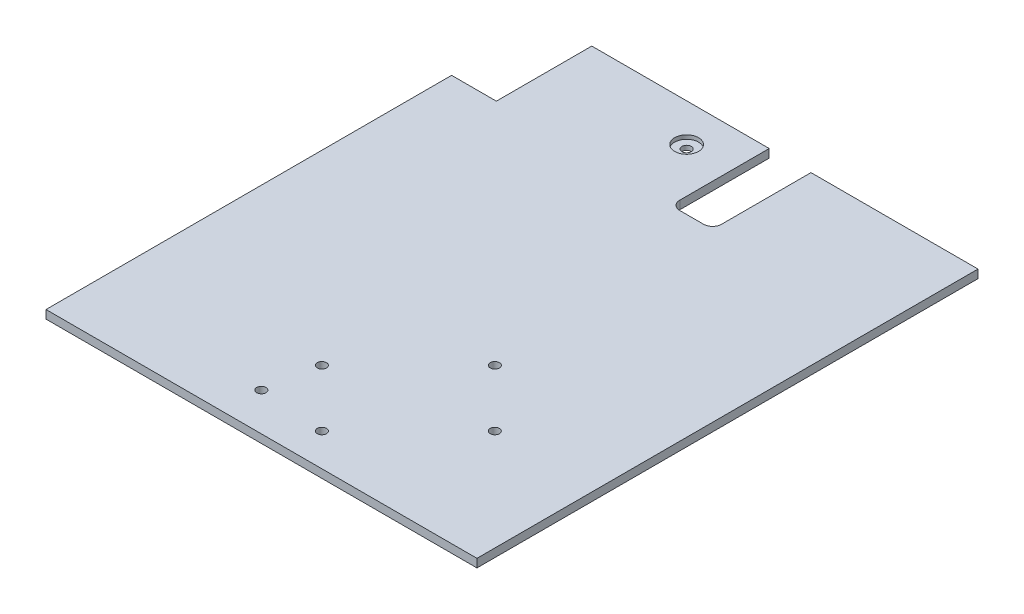
ISO-10303-21;
HEADER;
FILE_DESCRIPTION(('STEP AP214'),'2;1');
FILE_NAME('part.step','',(''),(''),'','','');
FILE_SCHEMA(('AUTOMOTIVE_DESIGN { 1 0 10303 214 1 1 1 1 }'));
ENDSEC;
DATA;
#1=APPLICATION_CONTEXT('core data for automotive mechanical design processes');
#2=APPLICATION_PROTOCOL_DEFINITION('international standard','automotive_design',2000,#1);
#3=PRODUCT_CONTEXT('',#1,'mechanical');
#4=PRODUCT('Part','Part','',(#3));
#5=PRODUCT_RELATED_PRODUCT_CATEGORY('part','',(#4));
#6=PRODUCT_DEFINITION_FORMATION('','',#4);
#7=PRODUCT_DEFINITION_CONTEXT('part definition',#1,'design');
#8=PRODUCT_DEFINITION('design','',#6,#7);
#9=PRODUCT_DEFINITION_SHAPE('','',#8);
#10=(LENGTH_UNIT() NAMED_UNIT(*) SI_UNIT(.MILLI.,.METRE.));
#11=(NAMED_UNIT(*) PLANE_ANGLE_UNIT() SI_UNIT($,.RADIAN.));
#12=(NAMED_UNIT(*) SI_UNIT($,.STERADIAN.) SOLID_ANGLE_UNIT());
#13=UNCERTAINTY_MEASURE_WITH_UNIT(LENGTH_MEASURE(1.E-05),#10,'distance_accuracy_value','');
#14=(GEOMETRIC_REPRESENTATION_CONTEXT(3) GLOBAL_UNCERTAINTY_ASSIGNED_CONTEXT((#13)) GLOBAL_UNIT_ASSIGNED_CONTEXT((#10,
#11,#12)) REPRESENTATION_CONTEXT('',''));
#15=CARTESIAN_POINT('',(0.,0.,0.));
#16=DIRECTION('',(0.,0.,1.));
#17=DIRECTION('',(1.,0.,0.));
#18=AXIS2_PLACEMENT_3D('',#15,#16,#17);
#19=CARTESIAN_POINT('',(0.,2.8,-84.));
#20=DIRECTION('',(0.,0.,-1.));
#21=DIRECTION('',(-1.,0.,0.));
#22=AXIS2_PLACEMENT_3D('',#19,#20,#21);
#23=PLANE('',#22);
#24=DIRECTION('',(0.,1.,0.));
#25=VECTOR('',#24,1.);
#26=CARTESIAN_POINT('',(16.25,-0.00100000000000013,-84.));
#27=LINE('',#26,#25);
#28=CARTESIAN_POINT('',(16.25,0.,-84.));
#29=VERTEX_POINT('',#28);
#30=CARTESIAN_POINT('',(16.25,2.8,-84.));
#31=VERTEX_POINT('',#30);
#32=EDGE_CURVE('E248',#29,#31,#27,.T.);
#33=ORIENTED_EDGE('',*,*,#32,.T.);
#34=DIRECTION('',(1.,0.,0.));
#35=VECTOR('',#34,1.);
#36=CARTESIAN_POINT('',(0.,2.8,-84.));
#37=LINE('',#36,#35);
#38=CARTESIAN_POINT('',(72.25,2.8,-84.));
#39=VERTEX_POINT('',#38);
#40=EDGE_CURVE('E60',#31,#39,#37,.T.);
#41=ORIENTED_EDGE('',*,*,#40,.T.);
#42=DIRECTION('',(0.,-1.,0.));
#43=VECTOR('',#42,1.);
#44=CARTESIAN_POINT('',(72.25,2.8,-84.));
#45=LINE('',#44,#43);
#46=CARTESIAN_POINT('',(72.25,0.,-84.));
#47=VERTEX_POINT('',#46);
#48=EDGE_CURVE('E139',#39,#47,#45,.T.);
#49=ORIENTED_EDGE('',*,*,#48,.T.);
#50=DIRECTION('',(1.,0.,0.));
#51=VECTOR('',#50,1.);
#52=CARTESIAN_POINT('',(0.,0.,-84.));
#53=LINE('',#52,#51);
#54=EDGE_CURVE('E87',#29,#47,#53,.T.);
#55=ORIENTED_EDGE('',*,*,#54,.F.);
#56=EDGE_LOOP('',(#33,#41,#49,#55));
#57=FACE_BOUND('',#56,.T.);
#58=ADVANCED_FACE('F35',(#57),#23,.T.);
#59=CARTESIAN_POINT('',(-12.75,-0.00100000000000013,-71.3));
#60=DIRECTION('',(0.,1.,0.));
#61=DIRECTION('',(0.,0.,1.));
#62=AXIS2_PLACEMENT_3D('',#59,#60,#61);
#63=CYLINDRICAL_SURFACE('',#62,1.54999999999999);
#64=CARTESIAN_POINT('',(-12.75,0.,-71.3));
#65=DIRECTION('',(0.,1.,0.));
#66=DIRECTION('',(0.,0.,1.));
#67=AXIS2_PLACEMENT_3D('',#64,#65,#66);
#68=CIRCLE('',#67,1.54999999999999);
#69=CARTESIAN_POINT('',(-12.75,0.,-69.75));
#70=VERTEX_POINT('',#69);
#71=EDGE_CURVE('E144',#70,#70,#68,.F.);
#72=ORIENTED_EDGE('',*,*,#71,.T.);
#73=EDGE_LOOP('',(#72));
#74=FACE_BOUND('',#73,.T.);
#75=CARTESIAN_POINT('',(-12.75,1.5,-71.3));
#76=DIRECTION('',(0.,1.,0.));
#77=DIRECTION('',(0.,0.,1.));
#78=AXIS2_PLACEMENT_3D('',#75,#76,#77);
#79=CIRCLE('',#78,1.54999999999999);
#80=CARTESIAN_POINT('',(-12.75,1.5,-69.75));
#81=VERTEX_POINT('',#80);
#82=EDGE_CURVE('E39',#81,#81,#79,.F.);
#83=ORIENTED_EDGE('',*,*,#82,.F.);
#84=EDGE_LOOP('',(#83));
#85=FACE_BOUND('',#84,.T.);
#86=ADVANCED_FACE('F318',(#74,#85),#63,.F.);
#87=DIRECTION('',(0.,1.,0.));
#88=VECTOR('',#87,1.);
#89=CARTESIAN_POINT('',(2.24999999999999,-0.00100000000000013,-84.));
#90=LINE('',#89,#88);
#91=CARTESIAN_POINT('',(2.24999999999999,0.,-84.));
#92=VERTEX_POINT('',#91);
#93=CARTESIAN_POINT('',(2.24999999999999,2.8,-84.));
#94=VERTEX_POINT('',#93);
#95=EDGE_CURVE('E208',#92,#94,#90,.T.);
#96=ORIENTED_EDGE('',*,*,#95,.F.);
#97=CARTESIAN_POINT('',(-57.25,0.,-84.));
#98=VERTEX_POINT('',#97);
#99=EDGE_CURVE('E153',#98,#92,#53,.T.);
#100=ORIENTED_EDGE('',*,*,#99,.F.);
#101=DIRECTION('',(0.,-1.,0.));
#102=VECTOR('',#101,1.);
#103=CARTESIAN_POINT('',(-57.25,2.8,-84.));
#104=LINE('',#103,#102);
#105=CARTESIAN_POINT('',(-57.25,2.8,-84.));
#106=VERTEX_POINT('',#105);
#107=EDGE_CURVE('E11',#106,#98,#104,.T.);
#108=ORIENTED_EDGE('',*,*,#107,.F.);
#109=EDGE_CURVE('E192',#106,#94,#37,.T.);
#110=ORIENTED_EDGE('',*,*,#109,.T.);
#111=EDGE_LOOP('',(#96,#100,#108,#110));
#112=FACE_BOUND('',#111,.T.);
#113=ADVANCED_FACE('F205',(#112),#23,.T.);
#114=CARTESIAN_POINT('',(-57.25,2.8,0.));
#115=DIRECTION('',(1.,0.,0.));
#116=DIRECTION('',(0.,0.,-1.));
#117=AXIS2_PLACEMENT_3D('',#114,#115,#116);
#118=PLANE('',#117);
#119=DIRECTION('',(0.,0.,1.));
#120=VECTOR('',#119,1.);
#121=CARTESIAN_POINT('',(-57.25,0.,0.));
#122=LINE('',#121,#120);
#123=CARTESIAN_POINT('',(-57.25,0.,-52.));
#124=VERTEX_POINT('',#123);
#125=EDGE_CURVE('E156',#98,#124,#122,.T.);
#126=ORIENTED_EDGE('',*,*,#125,.T.);
#127=DIRECTION('',(0.,-1.,0.));
#128=VECTOR('',#127,1.);
#129=CARTESIAN_POINT('',(-57.25,2.8,-52.));
#130=LINE('',#129,#128);
#131=CARTESIAN_POINT('',(-57.25,2.8,-52.));
#132=VERTEX_POINT('',#131);
#133=EDGE_CURVE('E44',#132,#124,#130,.T.);
#134=ORIENTED_EDGE('',*,*,#133,.F.);
#135=DIRECTION('',(0.,0.,1.));
#136=VECTOR('',#135,1.);
#137=CARTESIAN_POINT('',(-57.25,2.8,0.));
#138=LINE('',#137,#136);
#139=EDGE_CURVE('E134',#106,#132,#138,.T.);
#140=ORIENTED_EDGE('',*,*,#139,.F.);
#141=ORIENTED_EDGE('',*,*,#107,.T.);
#142=EDGE_LOOP('',(#126,#134,#140,#141));
#143=FACE_BOUND('',#142,.T.);
#144=ADVANCED_FACE('F178',(#143),#118,.F.);
#145=CARTESIAN_POINT('',(0.,2.8,-52.));
#146=DIRECTION('',(0.,0.,-1.));
#147=DIRECTION('',(-1.,0.,0.));
#148=AXIS2_PLACEMENT_3D('',#145,#146,#147);
#149=PLANE('',#148);
#150=DIRECTION('',(1.,0.,0.));
#151=VECTOR('',#150,1.);
#152=CARTESIAN_POINT('',(0.,0.,-52.));
#153=LINE('',#152,#151);
#154=CARTESIAN_POINT('',(-72.25,0.,-52.));
#155=VERTEX_POINT('',#154);
#156=EDGE_CURVE('E159',#155,#124,#153,.T.);
#157=ORIENTED_EDGE('',*,*,#156,.F.);
#158=DIRECTION('',(0.,-1.,0.));
#159=VECTOR('',#158,1.);
#160=CARTESIAN_POINT('',(-72.25,2.8,-52.));
#161=LINE('',#160,#159);
#162=CARTESIAN_POINT('',(-72.25,2.8,-52.));
#163=VERTEX_POINT('',#162);
#164=EDGE_CURVE('E116',#163,#155,#161,.T.);
#165=ORIENTED_EDGE('',*,*,#164,.F.);
#166=DIRECTION('',(1.,0.,0.));
#167=VECTOR('',#166,1.);
#168=CARTESIAN_POINT('',(0.,2.8,-52.));
#169=LINE('',#168,#167);
#170=EDGE_CURVE('E132',#163,#132,#169,.T.);
#171=ORIENTED_EDGE('',*,*,#170,.T.);
#172=ORIENTED_EDGE('',*,*,#133,.T.);
#173=EDGE_LOOP('',(#157,#165,#171,#172));
#174=FACE_BOUND('',#173,.T.);
#175=ADVANCED_FACE('F175',(#174),#149,.T.);
#176=CARTESIAN_POINT('',(-72.25,2.8,0.));
#177=DIRECTION('',(-1.,0.,0.));
#178=DIRECTION('',(0.,0.,1.));
#179=AXIS2_PLACEMENT_3D('',#176,#177,#178);
#180=PLANE('',#179);
#181=DIRECTION('',(0.,0.,-1.));
#182=VECTOR('',#181,1.);
#183=CARTESIAN_POINT('',(-72.25,0.,0.));
#184=LINE('',#183,#182);
#185=CARTESIAN_POINT('',(-72.25,0.,84.));
#186=VERTEX_POINT('',#185);
#187=EDGE_CURVE('E112',#186,#155,#184,.T.);
#188=ORIENTED_EDGE('',*,*,#187,.F.);
#189=DIRECTION('',(0.,-1.,0.));
#190=VECTOR('',#189,1.);
#191=CARTESIAN_POINT('',(-72.25,2.8,84.));
#192=LINE('',#191,#190);
#193=CARTESIAN_POINT('',(-72.25,2.8,84.));
#194=VERTEX_POINT('',#193);
#195=EDGE_CURVE('E106',#194,#186,#192,.T.);
#196=ORIENTED_EDGE('',*,*,#195,.F.);
#197=DIRECTION('',(0.,0.,-1.));
#198=VECTOR('',#197,1.);
#199=CARTESIAN_POINT('',(-72.25,2.8,0.));
#200=LINE('',#199,#198);
#201=EDGE_CURVE('E110',#194,#163,#200,.T.);
#202=ORIENTED_EDGE('',*,*,#201,.T.);
#203=ORIENTED_EDGE('',*,*,#164,.T.);
#204=EDGE_LOOP('',(#188,#196,#202,#203));
#205=FACE_BOUND('',#204,.T.);
#206=ADVANCED_FACE('F108',(#205),#180,.T.);
#207=CARTESIAN_POINT('',(0.,2.8,84.));
#208=DIRECTION('',(0.,0.,-1.));
#209=DIRECTION('',(-1.,0.,0.));
#210=AXIS2_PLACEMENT_3D('',#207,#208,#209);
#211=PLANE('',#210);
#212=DIRECTION('',(1.,0.,0.));
#213=VECTOR('',#212,1.);
#214=CARTESIAN_POINT('',(0.,0.,84.));
#215=LINE('',#214,#213);
#216=CARTESIAN_POINT('',(72.25,0.,84.));
#217=VERTEX_POINT('',#216);
#218=EDGE_CURVE('E163',#186,#217,#215,.T.);
#219=ORIENTED_EDGE('',*,*,#218,.T.);
#220=DIRECTION('',(0.,-1.,0.));
#221=VECTOR('',#220,1.);
#222=CARTESIAN_POINT('',(72.25,2.8,84.));
#223=LINE('',#222,#221);
#224=CARTESIAN_POINT('',(72.25,2.8,84.));
#225=VERTEX_POINT('',#224);
#226=EDGE_CURVE('E117',#225,#217,#223,.T.);
#227=ORIENTED_EDGE('',*,*,#226,.F.);
#228=DIRECTION('',(1.,0.,0.));
#229=VECTOR('',#228,1.);
#230=CARTESIAN_POINT('',(0.,2.8,84.));
#231=LINE('',#230,#229);
#232=EDGE_CURVE('E121',#194,#225,#231,.T.);
#233=ORIENTED_EDGE('',*,*,#232,.F.);
#234=ORIENTED_EDGE('',*,*,#195,.T.);
#235=EDGE_LOOP('',(#219,#227,#233,#234));
#236=FACE_BOUND('',#235,.T.);
#237=ADVANCED_FACE('F122',(#236),#211,.F.);
#238=CARTESIAN_POINT('',(19.1997474683059,2.8,24.9583694396574));
#239=DIRECTION('',(0.,-1.,0.));
#240=DIRECTION('',(0.,0.,-1.));
#241=AXIS2_PLACEMENT_3D('',#238,#239,#240);
#242=CYLINDRICAL_SURFACE('',#241,1.55);
#243=CARTESIAN_POINT('',(19.1997474683059,2.8,24.9583694396574));
#244=DIRECTION('',(0.,1.,0.));
#245=DIRECTION('',(0.,0.,1.));
#246=AXIS2_PLACEMENT_3D('',#243,#244,#245);
#247=CIRCLE('',#246,1.55);
#248=CARTESIAN_POINT('',(19.1997474683059,2.8,26.5083694396574));
#249=VERTEX_POINT('',#248);
#250=EDGE_CURVE('E193',#249,#249,#247,.T.);
#251=ORIENTED_EDGE('',*,*,#250,.T.);
#252=EDGE_LOOP('',(#251));
#253=FACE_BOUND('',#252,.T.);
#254=CARTESIAN_POINT('',(19.1997474683059,0.,24.9583694396574));
#255=DIRECTION('',(0.,1.,0.));
#256=DIRECTION('',(0.,0.,1.));
#257=AXIS2_PLACEMENT_3D('',#254,#255,#256);
#258=CIRCLE('',#257,1.55);
#259=CARTESIAN_POINT('',(19.1997474683059,0.,26.5083694396574));
#260=VERTEX_POINT('',#259);
#261=EDGE_CURVE('E150',#260,#260,#258,.T.);
#262=ORIENTED_EDGE('',*,*,#261,.F.);
#263=EDGE_LOOP('',(#262));
#264=FACE_BOUND('',#263,.T.);
#265=ADVANCED_FACE('F298',(#253,#264),#242,.F.);
#266=CARTESIAN_POINT('',(38.2916305603426,2.8,44.0502525316942));
#267=DIRECTION('',(0.,-1.,0.));
#268=DIRECTION('',(0.,0.,-1.));
#269=AXIS2_PLACEMENT_3D('',#266,#267,#268);
#270=CYLINDRICAL_SURFACE('',#269,1.55);
#271=CARTESIAN_POINT('',(38.2916305603426,2.8,44.0502525316942));
#272=DIRECTION('',(0.,1.,0.));
#273=DIRECTION('',(0.,0.,1.));
#274=AXIS2_PLACEMENT_3D('',#271,#272,#273);
#275=CIRCLE('',#274,1.55);
#276=CARTESIAN_POINT('',(38.2916305603426,2.8,45.6002525316942));
#277=VERTEX_POINT('',#276);
#278=EDGE_CURVE('E196',#277,#277,#275,.T.);
#279=ORIENTED_EDGE('',*,*,#278,.T.);
#280=EDGE_LOOP('',(#279));
#281=FACE_BOUND('',#280,.T.);
#282=CARTESIAN_POINT('',(38.2916305603426,0.,44.0502525316942));
#283=DIRECTION('',(0.,1.,0.));
#284=DIRECTION('',(0.,0.,1.));
#285=AXIS2_PLACEMENT_3D('',#282,#283,#284);
#286=CIRCLE('',#285,1.55);
#287=CARTESIAN_POINT('',(38.2916305603426,0.,45.6002525316942));
#288=VERTEX_POINT('',#287);
#289=EDGE_CURVE('E147',#288,#288,#286,.T.);
#290=ORIENTED_EDGE('',*,*,#289,.F.);
#291=EDGE_LOOP('',(#290));
#292=FACE_BOUND('',#291,.T.);
#293=ADVANCED_FACE('F290',(#281,#292),#270,.F.);
#294=CARTESIAN_POINT('',(-9.79163056034263,2.8,53.9497474683058));
#295=DIRECTION('',(0.,-1.,0.));
#296=DIRECTION('',(0.,0.,-1.));
#297=AXIS2_PLACEMENT_3D('',#294,#295,#296);
#298=CYLINDRICAL_SURFACE('',#297,1.55);
#299=CARTESIAN_POINT('',(-9.79163056034263,2.8,53.9497474683058));
#300=DIRECTION('',(0.,1.,0.));
#301=DIRECTION('',(0.,0.,1.));
#302=AXIS2_PLACEMENT_3D('',#299,#300,#301);
#303=CIRCLE('',#302,1.55);
#304=CARTESIAN_POINT('',(-9.79163056034263,2.8,55.4997474683058));
#305=VERTEX_POINT('',#304);
#306=EDGE_CURVE('E285',#305,#305,#303,.T.);
#307=ORIENTED_EDGE('',*,*,#306,.T.);
#308=EDGE_LOOP('',(#307));
#309=FACE_BOUND('',#308,.T.);
#310=CARTESIAN_POINT('',(-9.79163056034263,0.,53.9497474683058));
#311=DIRECTION('',(0.,1.,0.));
#312=DIRECTION('',(0.,0.,1.));
#313=AXIS2_PLACEMENT_3D('',#310,#311,#312);
#314=CIRCLE('',#313,1.55);
#315=CARTESIAN_POINT('',(-9.79163056034263,0.,55.4997474683058));
#316=VERTEX_POINT('',#315);
#317=EDGE_CURVE('E143',#316,#316,#314,.T.);
#318=ORIENTED_EDGE('',*,*,#317,.F.);
#319=EDGE_LOOP('',(#318));
#320=FACE_BOUND('',#319,.T.);
#321=ADVANCED_FACE('F342',(#309,#320),#298,.F.);
#322=CARTESIAN_POINT('',(9.30025253169412,2.8,73.0416305603426));
#323=DIRECTION('',(0.,-1.,0.));
#324=DIRECTION('',(0.,0.,-1.));
#325=AXIS2_PLACEMENT_3D('',#322,#323,#324);
#326=CYLINDRICAL_SURFACE('',#325,1.55);
#327=CARTESIAN_POINT('',(9.30025253169412,2.8,73.0416305603426));
#328=DIRECTION('',(0.,1.,0.));
#329=DIRECTION('',(0.,0.,1.));
#330=AXIS2_PLACEMENT_3D('',#327,#328,#329);
#331=CIRCLE('',#330,1.55);
#332=CARTESIAN_POINT('',(9.30025253169412,2.8,74.5916305603426));
#333=VERTEX_POINT('',#332);
#334=EDGE_CURVE('E168',#333,#333,#331,.T.);
#335=ORIENTED_EDGE('',*,*,#334,.T.);
#336=EDGE_LOOP('',(#335));
#337=FACE_BOUND('',#336,.T.);
#338=CARTESIAN_POINT('',(9.30025253169412,0.,73.0416305603426));
#339=DIRECTION('',(0.,1.,0.));
#340=DIRECTION('',(0.,0.,1.));
#341=AXIS2_PLACEMENT_3D('',#338,#339,#340);
#342=CIRCLE('',#341,1.55);
#343=CARTESIAN_POINT('',(9.30025253169412,0.,74.5916305603426));
#344=VERTEX_POINT('',#343);
#345=EDGE_CURVE('E140',#344,#344,#342,.T.);
#346=ORIENTED_EDGE('',*,*,#345,.F.);
#347=EDGE_LOOP('',(#346));
#348=FACE_BOUND('',#347,.T.);
#349=ADVANCED_FACE('F37',(#337,#348),#326,.F.);
#350=CARTESIAN_POINT('',(72.25,2.8,0.));
#351=DIRECTION('',(-1.,0.,0.));
#352=DIRECTION('',(0.,0.,1.));
#353=AXIS2_PLACEMENT_3D('',#350,#351,#352);
#354=PLANE('',#353);
#355=DIRECTION('',(0.,0.,-1.));
#356=VECTOR('',#355,1.);
#357=CARTESIAN_POINT('',(72.25,0.,0.));
#358=LINE('',#357,#356);
#359=EDGE_CURVE('E165',#217,#47,#358,.T.);
#360=ORIENTED_EDGE('',*,*,#359,.T.);
#361=ORIENTED_EDGE('',*,*,#48,.F.);
#362=DIRECTION('',(0.,0.,-1.));
#363=VECTOR('',#362,1.);
#364=CARTESIAN_POINT('',(72.25,2.8,0.));
#365=LINE('',#364,#363);
#366=EDGE_CURVE('E125',#225,#39,#365,.T.);
#367=ORIENTED_EDGE('',*,*,#366,.F.);
#368=ORIENTED_EDGE('',*,*,#226,.T.);
#369=EDGE_LOOP('',(#360,#361,#367,#368));
#370=FACE_BOUND('',#369,.T.);
#371=ADVANCED_FACE('F183',(#370),#354,.F.);
#372=CARTESIAN_POINT('',(0.,2.8,0.));
#373=DIRECTION('',(0.,1.,0.));
#374=DIRECTION('',(0.,0.,1.));
#375=AXIS2_PLACEMENT_3D('',#372,#373,#374);
#376=PLANE('',#375);
#377=DIRECTION('',(0.,0.,-1.));
#378=VECTOR('',#377,1.);
#379=CARTESIAN_POINT('',(16.25,2.8,-84.));
#380=LINE('',#379,#378);
#381=CARTESIAN_POINT('',(16.25,2.8,-54.));
#382=VERTEX_POINT('',#381);
#383=EDGE_CURVE('E188',#382,#31,#380,.T.);
#384=ORIENTED_EDGE('',*,*,#383,.F.);
#385=CARTESIAN_POINT('',(13.25,2.8,-54.));
#386=DIRECTION('',(0.,1.,0.));
#387=DIRECTION('',(0.,0.,-1.));
#388=AXIS2_PLACEMENT_3D('',#385,#386,#387);
#389=CIRCLE('',#388,3.);
#390=CARTESIAN_POINT('',(13.25,2.8,-51.));
#391=VERTEX_POINT('',#390);
#392=EDGE_CURVE('E241',#391,#382,#389,.T.);
#393=ORIENTED_EDGE('',*,*,#392,.F.);
#394=DIRECTION('',(1.,0.,0.));
#395=VECTOR('',#394,1.);
#396=CARTESIAN_POINT('',(13.25,2.8,-51.));
#397=LINE('',#396,#395);
#398=CARTESIAN_POINT('',(5.25,2.8,-51.));
#399=VERTEX_POINT('',#398);
#400=EDGE_CURVE('E260',#399,#391,#397,.T.);
#401=ORIENTED_EDGE('',*,*,#400,.F.);
#402=CARTESIAN_POINT('',(5.25,2.8,-54.));
#403=DIRECTION('',(0.,1.,0.));
#404=DIRECTION('',(0.,0.,1.));
#405=AXIS2_PLACEMENT_3D('',#402,#403,#404);
#406=CIRCLE('',#405,3.);
#407=CARTESIAN_POINT('',(2.25,2.8,-54.));
#408=VERTEX_POINT('',#407);
#409=EDGE_CURVE('E257',#408,#399,#406,.T.);
#410=ORIENTED_EDGE('',*,*,#409,.F.);
#411=DIRECTION('',(0.,0.,1.));
#412=VECTOR('',#411,1.);
#413=CARTESIAN_POINT('',(2.24999999999999,2.8,-84.));
#414=LINE('',#413,#412);
#415=EDGE_CURVE('E203',#94,#408,#414,.T.);
#416=ORIENTED_EDGE('',*,*,#415,.F.);
#417=ORIENTED_EDGE('',*,*,#109,.F.);
#418=ORIENTED_EDGE('',*,*,#139,.T.);
#419=ORIENTED_EDGE('',*,*,#170,.F.);
#420=ORIENTED_EDGE('',*,*,#201,.F.);
#421=ORIENTED_EDGE('',*,*,#232,.T.);
#422=ORIENTED_EDGE('',*,*,#366,.T.);
#423=ORIENTED_EDGE('',*,*,#40,.F.);
#424=EDGE_LOOP('',(#384,#393,#401,#410,#416,#417,#418,#419,#420,#421,#422,#423));
#425=FACE_BOUND('',#424,.T.);
#426=CARTESIAN_POINT('',(-12.75,2.8,-71.3));
#427=DIRECTION('',(0.,1.,0.));
#428=DIRECTION('',(0.,0.,1.));
#429=AXIS2_PLACEMENT_3D('',#426,#427,#428);
#430=CIRCLE('',#429,4.);
#431=CARTESIAN_POINT('',(-12.75,2.8,-67.3));
#432=VERTEX_POINT('',#431);
#433=EDGE_CURVE('E243',#432,#432,#430,.T.);
#434=ORIENTED_EDGE('',*,*,#433,.F.);
#435=EDGE_LOOP('',(#434));
#436=FACE_BOUND('',#435,.T.);
#437=CARTESIAN_POINT('',(-12.75,2.8,71.3));
#438=DIRECTION('',(0.,1.,0.));
#439=DIRECTION('',(0.,0.,1.));
#440=AXIS2_PLACEMENT_3D('',#437,#438,#439);
#441=CIRCLE('',#440,1.55);
#442=CARTESIAN_POINT('',(-12.75,2.8,72.85));
#443=VERTEX_POINT('',#442);
#444=EDGE_CURVE('E278',#443,#443,#441,.T.);
#445=ORIENTED_EDGE('',*,*,#444,.F.);
#446=EDGE_LOOP('',(#445));
#447=FACE_BOUND('',#446,.T.);
#448=ORIENTED_EDGE('',*,*,#334,.F.);
#449=EDGE_LOOP('',(#448));
#450=FACE_BOUND('',#449,.T.);
#451=ORIENTED_EDGE('',*,*,#306,.F.);
#452=EDGE_LOOP('',(#451));
#453=FACE_BOUND('',#452,.T.);
#454=ORIENTED_EDGE('',*,*,#278,.F.);
#455=EDGE_LOOP('',(#454));
#456=FACE_BOUND('',#455,.T.);
#457=ORIENTED_EDGE('',*,*,#250,.F.);
#458=EDGE_LOOP('',(#457));
#459=FACE_BOUND('',#458,.T.);
#460=ADVANCED_FACE('F129',(#425,#436,#447,#450,#453,#456,#459),#376,.T.);
#461=CARTESIAN_POINT('',(0.,0.,0.));
#462=DIRECTION('',(0.,1.,0.));
#463=DIRECTION('',(0.,0.,1.));
#464=AXIS2_PLACEMENT_3D('',#461,#462,#463);
#465=PLANE('',#464);
#466=ORIENTED_EDGE('',*,*,#71,.F.);
#467=EDGE_LOOP('',(#466));
#468=FACE_BOUND('',#467,.T.);
#469=CARTESIAN_POINT('',(-12.75,0.,71.3));
#470=DIRECTION('',(0.,1.,0.));
#471=DIRECTION('',(0.,0.,1.));
#472=AXIS2_PLACEMENT_3D('',#469,#470,#471);
#473=CIRCLE('',#472,1.55);
#474=CARTESIAN_POINT('',(-12.75,0.,72.85));
#475=VERTEX_POINT('',#474);
#476=EDGE_CURVE('E277',#475,#475,#473,.F.);
#477=ORIENTED_EDGE('',*,*,#476,.F.);
#478=EDGE_LOOP('',(#477));
#479=FACE_BOUND('',#478,.T.);
#480=ORIENTED_EDGE('',*,*,#345,.T.);
#481=EDGE_LOOP('',(#480));
#482=FACE_BOUND('',#481,.T.);
#483=ORIENTED_EDGE('',*,*,#317,.T.);
#484=EDGE_LOOP('',(#483));
#485=FACE_BOUND('',#484,.T.);
#486=ORIENTED_EDGE('',*,*,#289,.T.);
#487=EDGE_LOOP('',(#486));
#488=FACE_BOUND('',#487,.T.);
#489=ORIENTED_EDGE('',*,*,#261,.T.);
#490=EDGE_LOOP('',(#489));
#491=FACE_BOUND('',#490,.T.);
#492=CARTESIAN_POINT('',(13.25,0.,-54.));
#493=DIRECTION('',(0.,1.,0.));
#494=DIRECTION('',(0.,0.,1.));
#495=AXIS2_PLACEMENT_3D('',#492,#493,#494);
#496=CIRCLE('',#495,3.);
#497=CARTESIAN_POINT('',(16.25,0.,-54.));
#498=VERTEX_POINT('',#497);
#499=CARTESIAN_POINT('',(13.25,0.,-51.));
#500=VERTEX_POINT('',#499);
#501=EDGE_CURVE('E239',#498,#500,#496,.F.);
#502=ORIENTED_EDGE('',*,*,#501,.F.);
#503=DIRECTION('',(0.,0.,1.));
#504=VECTOR('',#503,1.);
#505=CARTESIAN_POINT('',(16.25,0.,-84.));
#506=LINE('',#505,#504);
#507=EDGE_CURVE('E246',#29,#498,#506,.T.);
#508=ORIENTED_EDGE('',*,*,#507,.F.);
#509=ORIENTED_EDGE('',*,*,#54,.T.);
#510=ORIENTED_EDGE('',*,*,#359,.F.);
#511=ORIENTED_EDGE('',*,*,#218,.F.);
#512=ORIENTED_EDGE('',*,*,#187,.T.);
#513=ORIENTED_EDGE('',*,*,#156,.T.);
#514=ORIENTED_EDGE('',*,*,#125,.F.);
#515=ORIENTED_EDGE('',*,*,#99,.T.);
#516=DIRECTION('',(0.,0.,-1.));
#517=VECTOR('',#516,1.);
#518=CARTESIAN_POINT('',(2.24999999999999,0.,-84.));
#519=LINE('',#518,#517);
#520=CARTESIAN_POINT('',(2.25,0.,-54.));
#521=VERTEX_POINT('',#520);
#522=EDGE_CURVE('E472',#521,#92,#519,.T.);
#523=ORIENTED_EDGE('',*,*,#522,.F.);
#524=CARTESIAN_POINT('',(5.25,0.,-54.));
#525=DIRECTION('',(0.,1.,0.));
#526=DIRECTION('',(0.,0.,1.));
#527=AXIS2_PLACEMENT_3D('',#524,#525,#526);
#528=CIRCLE('',#527,3.);
#529=CARTESIAN_POINT('',(5.25,0.,-51.));
#530=VERTEX_POINT('',#529);
#531=EDGE_CURVE('E51',#530,#521,#528,.F.);
#532=ORIENTED_EDGE('',*,*,#531,.F.);
#533=DIRECTION('',(-1.,0.,0.));
#534=VECTOR('',#533,1.);
#535=CARTESIAN_POINT('',(13.25,0.,-51.));
#536=LINE('',#535,#534);
#537=EDGE_CURVE('E250',#500,#530,#536,.T.);
#538=ORIENTED_EDGE('',*,*,#537,.F.);
#539=EDGE_LOOP('',(#502,#508,#509,#510,#511,#512,#513,#514,#515,#523,#532,#538));
#540=FACE_BOUND('',#539,.T.);
#541=ADVANCED_FACE('F180',(#468,#479,#482,#485,#488,#491,#540),#465,.F.);
#542=CARTESIAN_POINT('',(-12.75,-0.00100000000000013,71.3));
#543=DIRECTION('',(0.,1.,0.));
#544=DIRECTION('',(0.,0.,1.));
#545=AXIS2_PLACEMENT_3D('',#542,#543,#544);
#546=CYLINDRICAL_SURFACE('',#545,1.55);
#547=ORIENTED_EDGE('',*,*,#444,.T.);
#548=EDGE_LOOP('',(#547));
#549=FACE_BOUND('',#548,.T.);
#550=ORIENTED_EDGE('',*,*,#476,.T.);
#551=EDGE_LOOP('',(#550));
#552=FACE_BOUND('',#551,.T.);
#553=ADVANCED_FACE('F305',(#549,#552),#546,.F.);
#554=CARTESIAN_POINT('',(-12.75,1.5,-71.3));
#555=DIRECTION('',(0.,1.,0.));
#556=DIRECTION('',(0.,0.,1.));
#557=AXIS2_PLACEMENT_3D('',#554,#555,#556);
#558=PLANE('',#557);
#559=CARTESIAN_POINT('',(-12.75,1.5,-71.3));
#560=DIRECTION('',(0.,1.,0.));
#561=DIRECTION('',(0.,0.,1.));
#562=AXIS2_PLACEMENT_3D('',#559,#560,#561);
#563=CIRCLE('',#562,4.);
#564=CARTESIAN_POINT('',(-12.75,1.5,-67.3));
#565=VERTEX_POINT('',#564);
#566=EDGE_CURVE('E270',#565,#565,#563,.T.);
#567=ORIENTED_EDGE('',*,*,#566,.T.);
#568=EDGE_LOOP('',(#567));
#569=FACE_BOUND('',#568,.T.);
#570=ORIENTED_EDGE('',*,*,#82,.T.);
#571=EDGE_LOOP('',(#570));
#572=FACE_BOUND('',#571,.T.);
#573=ADVANCED_FACE('F311',(#569,#572),#558,.T.);
#574=CARTESIAN_POINT('',(-12.75,1.5,-71.3));
#575=DIRECTION('',(0.,1.,0.));
#576=DIRECTION('',(0.,0.,1.));
#577=AXIS2_PLACEMENT_3D('',#574,#575,#576);
#578=CYLINDRICAL_SURFACE('',#577,4.);
#579=ORIENTED_EDGE('',*,*,#566,.F.);
#580=EDGE_LOOP('',(#579));
#581=FACE_BOUND('',#580,.T.);
#582=ORIENTED_EDGE('',*,*,#433,.T.);
#583=EDGE_LOOP('',(#582));
#584=FACE_BOUND('',#583,.T.);
#585=ADVANCED_FACE('F397',(#581,#584),#578,.F.);
#586=CARTESIAN_POINT('',(16.25,-0.00100000000000013,-84.));
#587=DIRECTION('',(1.,0.,0.));
#588=DIRECTION('',(0.,0.,-1.));
#589=AXIS2_PLACEMENT_3D('',#586,#587,#588);
#590=PLANE('',#589);
#591=ORIENTED_EDGE('',*,*,#507,.T.);
#592=DIRECTION('',(0.,1.,0.));
#593=VECTOR('',#592,1.);
#594=CARTESIAN_POINT('',(16.25,-0.00100000000000013,-54.));
#595=LINE('',#594,#593);
#596=EDGE_CURVE('E236',#498,#382,#595,.T.);
#597=ORIENTED_EDGE('',*,*,#596,.T.);
#598=ORIENTED_EDGE('',*,*,#383,.T.);
#599=ORIENTED_EDGE('',*,*,#32,.F.);
#600=EDGE_LOOP('',(#591,#597,#598,#599));
#601=FACE_BOUND('',#600,.T.);
#602=ADVANCED_FACE('F247',(#601),#590,.F.);
#603=CARTESIAN_POINT('',(13.25,-0.00100000000000013,-54.));
#604=DIRECTION('',(0.,1.,0.));
#605=DIRECTION('',(0.,0.,1.));
#606=AXIS2_PLACEMENT_3D('',#603,#604,#605);
#607=CYLINDRICAL_SURFACE('',#606,3.);
#608=ORIENTED_EDGE('',*,*,#501,.T.);
#609=DIRECTION('',(0.,1.,0.));
#610=VECTOR('',#609,1.);
#611=CARTESIAN_POINT('',(13.25,-0.00100000000000013,-51.));
#612=LINE('',#611,#610);
#613=EDGE_CURVE('E231',#500,#391,#612,.T.);
#614=ORIENTED_EDGE('',*,*,#613,.T.);
#615=ORIENTED_EDGE('',*,*,#392,.T.);
#616=ORIENTED_EDGE('',*,*,#596,.F.);
#617=EDGE_LOOP('',(#608,#614,#615,#616));
#618=FACE_BOUND('',#617,.T.);
#619=ADVANCED_FACE('F238',(#618),#607,.F.);
#620=CARTESIAN_POINT('',(13.25,-0.00100000000000013,-51.));
#621=DIRECTION('',(0.,0.,1.));
#622=DIRECTION('',(1.,0.,0.));
#623=AXIS2_PLACEMENT_3D('',#620,#621,#622);
#624=PLANE('',#623);
#625=ORIENTED_EDGE('',*,*,#537,.T.);
#626=DIRECTION('',(0.,1.,0.));
#627=VECTOR('',#626,1.);
#628=CARTESIAN_POINT('',(5.25,-0.00100000000000013,-51.));
#629=LINE('',#628,#627);
#630=EDGE_CURVE('E264',#530,#399,#629,.T.);
#631=ORIENTED_EDGE('',*,*,#630,.T.);
#632=ORIENTED_EDGE('',*,*,#400,.T.);
#633=ORIENTED_EDGE('',*,*,#613,.F.);
#634=EDGE_LOOP('',(#625,#631,#632,#633));
#635=FACE_BOUND('',#634,.T.);
#636=ADVANCED_FACE('F441',(#635),#624,.F.);
#637=CARTESIAN_POINT('',(5.25,-0.00100000000000013,-54.));
#638=DIRECTION('',(0.,1.,0.));
#639=DIRECTION('',(0.,0.,1.));
#640=AXIS2_PLACEMENT_3D('',#637,#638,#639);
#641=CYLINDRICAL_SURFACE('',#640,3.);
#642=ORIENTED_EDGE('',*,*,#531,.T.);
#643=DIRECTION('',(0.,1.,0.));
#644=VECTOR('',#643,1.);
#645=CARTESIAN_POINT('',(2.25,-0.00100000000000013,-54.));
#646=LINE('',#645,#644);
#647=EDGE_CURVE('E266',#521,#408,#646,.T.);
#648=ORIENTED_EDGE('',*,*,#647,.T.);
#649=ORIENTED_EDGE('',*,*,#409,.T.);
#650=ORIENTED_EDGE('',*,*,#630,.F.);
#651=EDGE_LOOP('',(#642,#648,#649,#650));
#652=FACE_BOUND('',#651,.T.);
#653=ADVANCED_FACE('F450',(#652),#641,.F.);
#654=CARTESIAN_POINT('',(2.24999999999999,-0.00100000000000013,-84.));
#655=DIRECTION('',(-1.,0.,0.));
#656=DIRECTION('',(0.,0.,1.));
#657=AXIS2_PLACEMENT_3D('',#654,#655,#656);
#658=PLANE('',#657);
#659=ORIENTED_EDGE('',*,*,#522,.T.);
#660=ORIENTED_EDGE('',*,*,#95,.T.);
#661=ORIENTED_EDGE('',*,*,#415,.T.);
#662=ORIENTED_EDGE('',*,*,#647,.F.);
#663=EDGE_LOOP('',(#659,#660,#661,#662));
#664=FACE_BOUND('',#663,.T.);
#665=ADVANCED_FACE('F459',(#664),#658,.F.);
#666=CLOSED_SHELL('',(#58,#86,#113,#144,#175,#206,#237,#265,#293,#321,#349,#371,#460,#541,#553,
#573,#585,#602,#619,#636,#653,#665));
#667=MANIFOLD_SOLID_BREP('B2',#666);
#668=ADVANCED_BREP_SHAPE_REPRESENTATION('',(#18,#667),#14);
#669=SHAPE_DEFINITION_REPRESENTATION(#9,#668);
ENDSEC;
END-ISO-10303-21;
